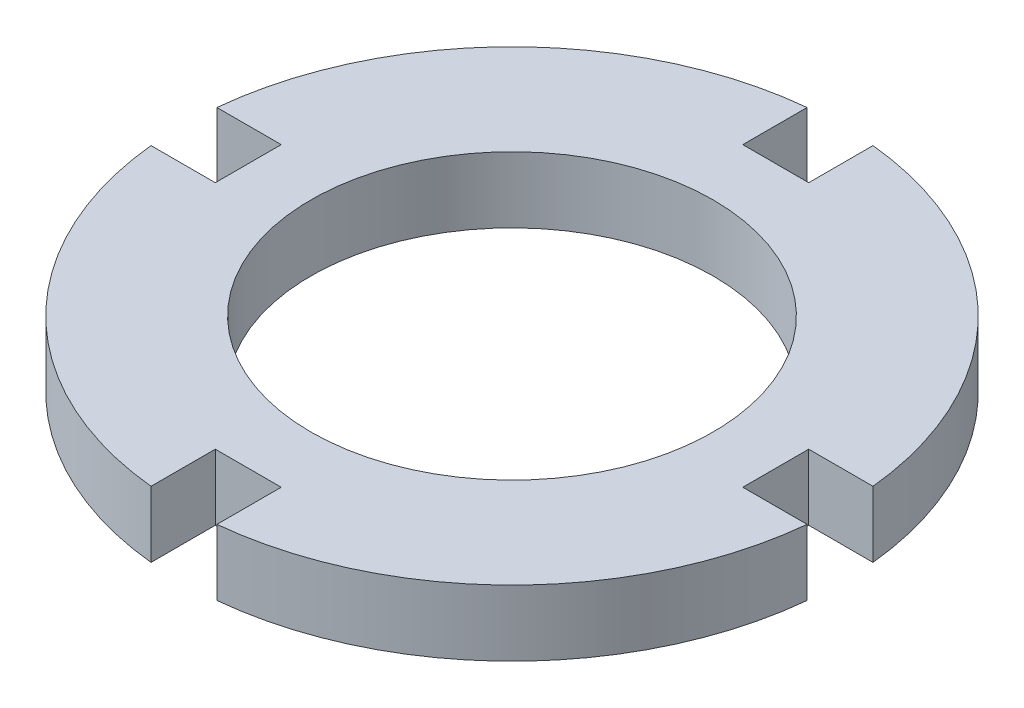
ISO-10303-21;
HEADER;
FILE_DESCRIPTION(('STEP AP214'),'2;1');
FILE_NAME('part.step','',(''),(''),'','','');
FILE_SCHEMA(('AUTOMOTIVE_DESIGN { 1 0 10303 214 1 1 1 1 }'));
ENDSEC;
DATA;
#1=APPLICATION_CONTEXT('core data for automotive mechanical design processes');
#2=APPLICATION_PROTOCOL_DEFINITION('international standard','automotive_design',2000,#1);
#3=PRODUCT_CONTEXT('',#1,'mechanical');
#4=PRODUCT('Part','Part','',(#3));
#5=PRODUCT_RELATED_PRODUCT_CATEGORY('part','',(#4));
#6=PRODUCT_DEFINITION_FORMATION('','',#4);
#7=PRODUCT_DEFINITION_CONTEXT('part definition',#1,'design');
#8=PRODUCT_DEFINITION('design','',#6,#7);
#9=PRODUCT_DEFINITION_SHAPE('','',#8);
#10=(LENGTH_UNIT() NAMED_UNIT(*) SI_UNIT(.MILLI.,.METRE.));
#11=(NAMED_UNIT(*) PLANE_ANGLE_UNIT() SI_UNIT($,.RADIAN.));
#12=(NAMED_UNIT(*) SI_UNIT($,.STERADIAN.) SOLID_ANGLE_UNIT());
#13=UNCERTAINTY_MEASURE_WITH_UNIT(LENGTH_MEASURE(1.E-05),#10,'distance_accuracy_value','');
#14=(GEOMETRIC_REPRESENTATION_CONTEXT(3) GLOBAL_UNCERTAINTY_ASSIGNED_CONTEXT((#13)) GLOBAL_UNIT_ASSIGNED_CONTEXT((#10,
#11,#12)) REPRESENTATION_CONTEXT('',''));
#15=CARTESIAN_POINT('',(0.,0.,0.));
#16=DIRECTION('',(0.,0.,1.));
#17=DIRECTION('',(1.,0.,0.));
#18=AXIS2_PLACEMENT_3D('',#15,#16,#17);
#19=CARTESIAN_POINT('',(0.,5.08,0.));
#20=DIRECTION('',(0.,-1.,0.));
#21=DIRECTION('',(0.,0.,-1.));
#22=AXIS2_PLACEMENT_3D('',#19,#20,#21);
#23=CYLINDRICAL_SURFACE('',#22,25.4);
#24=CARTESIAN_POINT('',(0.,5.08,0.));
#25=DIRECTION('',(0.,1.,0.));
#26=DIRECTION('',(0.,0.,1.));
#27=AXIS2_PLACEMENT_3D('',#24,#25,#26);
#28=CIRCLE('',#27,25.4);
#29=CARTESIAN_POINT('',(-25.2726809025081,5.08,2.54000000000009));
#30=VERTEX_POINT('',#29);
#31=CARTESIAN_POINT('',(-2.54,5.08,25.2726809025081));
#32=VERTEX_POINT('',#31);
#33=EDGE_CURVE('E251',#30,#32,#28,.T.);
#34=ORIENTED_EDGE('',*,*,#33,.F.);
#35=DIRECTION('',(0.,-1.,0.));
#36=VECTOR('',#35,1.);
#37=CARTESIAN_POINT('',(-25.2726809025081,5.08,2.54000000000009));
#38=LINE('',#37,#36);
#39=CARTESIAN_POINT('',(-25.2726809025081,0.,2.54000000000009));
#40=VERTEX_POINT('',#39);
#41=EDGE_CURVE('E218',#30,#40,#38,.T.);
#42=ORIENTED_EDGE('',*,*,#41,.T.);
#43=CARTESIAN_POINT('',(0.,0.,0.));
#44=DIRECTION('',(0.,1.,0.));
#45=DIRECTION('',(0.,0.,1.));
#46=AXIS2_PLACEMENT_3D('',#43,#44,#45);
#47=CIRCLE('',#46,25.4);
#48=CARTESIAN_POINT('',(-2.54,0.,25.2726809025081));
#49=VERTEX_POINT('',#48);
#50=EDGE_CURVE('E255',#40,#49,#47,.T.);
#51=ORIENTED_EDGE('',*,*,#50,.T.);
#52=DIRECTION('',(0.,-1.,0.));
#53=VECTOR('',#52,1.);
#54=CARTESIAN_POINT('',(-2.54,5.08,25.2726809025081));
#55=LINE('',#54,#53);
#56=EDGE_CURVE('E56',#49,#32,#55,.F.);
#57=ORIENTED_EDGE('',*,*,#56,.T.);
#58=EDGE_LOOP('',(#34,#42,#51,#57));
#59=FACE_BOUND('',#58,.T.);
#60=ADVANCED_FACE('F33',(#59),#23,.T.);
#61=CARTESIAN_POINT('',(2.54,5.08,25.2726809025081));
#62=VERTEX_POINT('',#61);
#63=CARTESIAN_POINT('',(25.2726809025082,5.08,2.53999999999974));
#64=VERTEX_POINT('',#63);
#65=EDGE_CURVE('E297',#62,#64,#28,.T.);
#66=ORIENTED_EDGE('',*,*,#65,.F.);
#67=DIRECTION('',(0.,-1.,0.));
#68=VECTOR('',#67,1.);
#69=CARTESIAN_POINT('',(2.54,5.08,25.2726809025081));
#70=LINE('',#69,#68);
#71=CARTESIAN_POINT('',(2.54,0.,25.2726809025081));
#72=VERTEX_POINT('',#71);
#73=EDGE_CURVE('E209',#62,#72,#70,.T.);
#74=ORIENTED_EDGE('',*,*,#73,.T.);
#75=CARTESIAN_POINT('',(25.2726809025082,0.,2.53999999999974));
#76=VERTEX_POINT('',#75);
#77=EDGE_CURVE('E269',#72,#76,#47,.T.);
#78=ORIENTED_EDGE('',*,*,#77,.T.);
#79=DIRECTION('',(0.,-1.,0.));
#80=VECTOR('',#79,1.);
#81=CARTESIAN_POINT('',(25.2726809025082,5.08,2.53999999999974));
#82=LINE('',#81,#80);
#83=EDGE_CURVE('E48',#76,#64,#82,.F.);
#84=ORIENTED_EDGE('',*,*,#83,.T.);
#85=EDGE_LOOP('',(#66,#74,#78,#84));
#86=FACE_BOUND('',#85,.T.);
#87=ADVANCED_FACE('F318',(#86),#23,.T.);
#88=CARTESIAN_POINT('',(25.2726809025081,5.08,-2.54000000000026));
#89=VERTEX_POINT('',#88);
#90=CARTESIAN_POINT('',(2.54,5.08,-25.2726809025081));
#91=VERTEX_POINT('',#90);
#92=EDGE_CURVE('E252',#89,#91,#28,.T.);
#93=ORIENTED_EDGE('',*,*,#92,.F.);
#94=DIRECTION('',(0.,-1.,0.));
#95=VECTOR('',#94,1.);
#96=CARTESIAN_POINT('',(25.2726809025081,5.08,-2.54000000000026));
#97=LINE('',#96,#95);
#98=CARTESIAN_POINT('',(25.2726809025081,0.,-2.54000000000026));
#99=VERTEX_POINT('',#98);
#100=EDGE_CURVE('E199',#89,#99,#97,.T.);
#101=ORIENTED_EDGE('',*,*,#100,.T.);
#102=CARTESIAN_POINT('',(2.54,0.,-25.2726809025081));
#103=VERTEX_POINT('',#102);
#104=EDGE_CURVE('E256',#99,#103,#47,.T.);
#105=ORIENTED_EDGE('',*,*,#104,.T.);
#106=DIRECTION('',(0.,-1.,0.));
#107=VECTOR('',#106,1.);
#108=CARTESIAN_POINT('',(2.54,5.08,-25.2726809025081));
#109=LINE('',#108,#107);
#110=EDGE_CURVE('E233',#103,#91,#109,.F.);
#111=ORIENTED_EDGE('',*,*,#110,.T.);
#112=EDGE_LOOP('',(#93,#101,#105,#111));
#113=FACE_BOUND('',#112,.T.);
#114=ADVANCED_FACE('F277',(#113),#23,.T.);
#115=CARTESIAN_POINT('',(-2.54,0.,-25.2726809025081));
#116=VERTEX_POINT('',#115);
#117=CARTESIAN_POINT('',(-25.2726809025082,0.,-2.53999999999991));
#118=VERTEX_POINT('',#117);
#119=EDGE_CURVE('E253',#116,#118,#47,.T.);
#120=ORIENTED_EDGE('',*,*,#119,.T.);
#121=DIRECTION('',(0.,-1.,0.));
#122=VECTOR('',#121,1.);
#123=CARTESIAN_POINT('',(-25.2726809025082,5.08,-2.53999999999991));
#124=LINE('',#123,#122);
#125=CARTESIAN_POINT('',(-25.2726809025082,5.08,-2.53999999999991));
#126=VERTEX_POINT('',#125);
#127=EDGE_CURVE('E163',#118,#126,#124,.F.);
#128=ORIENTED_EDGE('',*,*,#127,.T.);
#129=CARTESIAN_POINT('',(-2.54,5.08,-25.2726809025081));
#130=VERTEX_POINT('',#129);
#131=EDGE_CURVE('E247',#130,#126,#28,.T.);
#132=ORIENTED_EDGE('',*,*,#131,.F.);
#133=DIRECTION('',(0.,-1.,0.));
#134=VECTOR('',#133,1.);
#135=CARTESIAN_POINT('',(-2.54,5.08,-25.2726809025081));
#136=LINE('',#135,#134);
#137=EDGE_CURVE('E240',#130,#116,#136,.T.);
#138=ORIENTED_EDGE('',*,*,#137,.T.);
#139=EDGE_LOOP('',(#120,#128,#132,#138));
#140=FACE_BOUND('',#139,.T.);
#141=ADVANCED_FACE('F35',(#140),#23,.T.);
#142=CARTESIAN_POINT('',(0.,5.08,0.));
#143=DIRECTION('',(0.,1.,0.));
#144=DIRECTION('',(0.,0.,1.));
#145=AXIS2_PLACEMENT_3D('',#142,#143,#144);
#146=PLANE('',#145);
#147=DIRECTION('',(1.,0.,0.));
#148=VECTOR('',#147,1.);
#149=CARTESIAN_POINT('',(0.,5.08,2.54));
#150=LINE('',#149,#148);
#151=CARTESIAN_POINT('',(-20.32,5.08,2.54000000000007));
#152=VERTEX_POINT('',#151);
#153=EDGE_CURVE('E216',#30,#152,#150,.T.);
#154=ORIENTED_EDGE('',*,*,#153,.F.);
#155=ORIENTED_EDGE('',*,*,#33,.T.);
#156=DIRECTION('',(0.,0.,1.));
#157=VECTOR('',#156,1.);
#158=CARTESIAN_POINT('',(-2.54,5.08,0.));
#159=LINE('',#158,#157);
#160=CARTESIAN_POINT('',(-2.54,5.08,20.32));
#161=VERTEX_POINT('',#160);
#162=EDGE_CURVE('E202',#161,#32,#159,.T.);
#163=ORIENTED_EDGE('',*,*,#162,.F.);
#164=DIRECTION('',(-1.,0.,0.));
#165=VECTOR('',#164,1.);
#166=CARTESIAN_POINT('',(0.,5.08,20.32));
#167=LINE('',#166,#165);
#168=CARTESIAN_POINT('',(2.54,5.08,20.32));
#169=VERTEX_POINT('',#168);
#170=EDGE_CURVE('E205',#169,#161,#167,.T.);
#171=ORIENTED_EDGE('',*,*,#170,.F.);
#172=DIRECTION('',(0.,0.,-1.));
#173=VECTOR('',#172,1.);
#174=CARTESIAN_POINT('',(2.54,5.08,0.));
#175=LINE('',#174,#173);
#176=EDGE_CURVE('E207',#62,#169,#175,.T.);
#177=ORIENTED_EDGE('',*,*,#176,.F.);
#178=ORIENTED_EDGE('',*,*,#65,.T.);
#179=DIRECTION('',(1.,0.,0.));
#180=VECTOR('',#179,1.);
#181=CARTESIAN_POINT('',(0.,5.08,2.54));
#182=LINE('',#181,#180);
#183=CARTESIAN_POINT('',(20.32,5.08,2.53999999999979));
#184=VERTEX_POINT('',#183);
#185=EDGE_CURVE('E174',#184,#64,#182,.T.);
#186=ORIENTED_EDGE('',*,*,#185,.F.);
#187=DIRECTION('',(0.,0.,1.));
#188=VECTOR('',#187,1.);
#189=CARTESIAN_POINT('',(20.32,5.08,-2.12840702415877E-13));
#190=LINE('',#189,#188);
#191=CARTESIAN_POINT('',(20.32,5.08,-2.54000000000021));
#192=VERTEX_POINT('',#191);
#193=EDGE_CURVE('E195',#192,#184,#190,.T.);
#194=ORIENTED_EDGE('',*,*,#193,.F.);
#195=DIRECTION('',(-1.,0.,0.));
#196=VECTOR('',#195,1.);
#197=CARTESIAN_POINT('',(0.,5.08,-2.54));
#198=LINE('',#197,#196);
#199=EDGE_CURVE('E197',#89,#192,#198,.T.);
#200=ORIENTED_EDGE('',*,*,#199,.F.);
#201=ORIENTED_EDGE('',*,*,#92,.T.);
#202=DIRECTION('',(0.,0.,-1.));
#203=VECTOR('',#202,1.);
#204=CARTESIAN_POINT('',(2.54,5.08,0.));
#205=LINE('',#204,#203);
#206=CARTESIAN_POINT('',(2.54,5.08,-20.32));
#207=VERTEX_POINT('',#206);
#208=EDGE_CURVE('E229',#207,#91,#205,.T.);
#209=ORIENTED_EDGE('',*,*,#208,.F.);
#210=DIRECTION('',(1.,0.,0.));
#211=VECTOR('',#210,1.);
#212=CARTESIAN_POINT('',(0.,5.08,-20.32));
#213=LINE('',#212,#211);
#214=CARTESIAN_POINT('',(-2.54,5.08,-20.32));
#215=VERTEX_POINT('',#214);
#216=EDGE_CURVE('E236',#215,#207,#213,.T.);
#217=ORIENTED_EDGE('',*,*,#216,.F.);
#218=DIRECTION('',(0.,0.,1.));
#219=VECTOR('',#218,1.);
#220=CARTESIAN_POINT('',(-2.54,5.08,0.));
#221=LINE('',#220,#219);
#222=EDGE_CURVE('E238',#130,#215,#221,.T.);
#223=ORIENTED_EDGE('',*,*,#222,.F.);
#224=ORIENTED_EDGE('',*,*,#131,.T.);
#225=DIRECTION('',(-1.,0.,0.));
#226=VECTOR('',#225,1.);
#227=CARTESIAN_POINT('',(0.,5.08,-2.54));
#228=LINE('',#227,#226);
#229=CARTESIAN_POINT('',(-20.32,5.08,-2.53999999999993));
#230=VERTEX_POINT('',#229);
#231=EDGE_CURVE('E212',#230,#126,#228,.T.);
#232=ORIENTED_EDGE('',*,*,#231,.F.);
#233=DIRECTION('',(0.,0.,-1.));
#234=VECTOR('',#233,1.);
#235=CARTESIAN_POINT('',(-20.32,5.08,0.));
#236=LINE('',#235,#234);
#237=EDGE_CURVE('E156',#152,#230,#236,.T.);
#238=ORIENTED_EDGE('',*,*,#237,.F.);
#239=EDGE_LOOP('',(#154,#155,#163,#171,#177,#178,#186,#194,#200,#201,#209,#217,#223,#224,#232,#238));
#240=FACE_BOUND('',#239,.T.);
#241=CARTESIAN_POINT('',(0.,5.08,0.));
#242=DIRECTION('',(0.,1.,0.));
#243=DIRECTION('',(0.,0.,1.));
#244=AXIS2_PLACEMENT_3D('',#241,#242,#243);
#245=CIRCLE('',#244,15.494);
#246=CARTESIAN_POINT('',(0.,5.08,15.494));
#247=VERTEX_POINT('',#246);
#248=EDGE_CURVE('E243',#247,#247,#245,.T.);
#249=ORIENTED_EDGE('',*,*,#248,.F.);
#250=EDGE_LOOP('',(#249));
#251=FACE_BOUND('',#250,.T.);
#252=ADVANCED_FACE('F292',(#240,#251),#146,.T.);
#253=CARTESIAN_POINT('',(0.,0.,0.));
#254=DIRECTION('',(0.,1.,0.));
#255=DIRECTION('',(0.,0.,1.));
#256=AXIS2_PLACEMENT_3D('',#253,#254,#255);
#257=PLANE('',#256);
#258=CARTESIAN_POINT('',(0.,0.,0.));
#259=DIRECTION('',(0.,1.,0.));
#260=DIRECTION('',(0.,0.,1.));
#261=AXIS2_PLACEMENT_3D('',#258,#259,#260);
#262=CIRCLE('',#261,15.494);
#263=CARTESIAN_POINT('',(0.,0.,15.494));
#264=VERTEX_POINT('',#263);
#265=EDGE_CURVE('E246',#264,#264,#262,.T.);
#266=ORIENTED_EDGE('',*,*,#265,.T.);
#267=EDGE_LOOP('',(#266));
#268=FACE_BOUND('',#267,.T.);
#269=ORIENTED_EDGE('',*,*,#50,.F.);
#270=DIRECTION('',(-1.,0.,0.));
#271=VECTOR('',#270,1.);
#272=CARTESIAN_POINT('',(-30.48,0.,2.54000000000011));
#273=LINE('',#272,#271);
#274=CARTESIAN_POINT('',(-20.32,0.,2.54000000000007));
#275=VERTEX_POINT('',#274);
#276=EDGE_CURVE('E169',#275,#40,#273,.T.);
#277=ORIENTED_EDGE('',*,*,#276,.F.);
#278=DIRECTION('',(0.,0.,1.));
#279=VECTOR('',#278,1.);
#280=CARTESIAN_POINT('',(-20.32,0.,-2.53999999999993));
#281=LINE('',#280,#279);
#282=CARTESIAN_POINT('',(-20.32,0.,-2.53999999999993));
#283=VERTEX_POINT('',#282);
#284=EDGE_CURVE('E153',#283,#275,#281,.T.);
#285=ORIENTED_EDGE('',*,*,#284,.F.);
#286=DIRECTION('',(-1.,0.,0.));
#287=VECTOR('',#286,1.);
#288=CARTESIAN_POINT('',(0.,0.,-2.54));
#289=LINE('',#288,#287);
#290=EDGE_CURVE('E11',#283,#118,#289,.T.);
#291=ORIENTED_EDGE('',*,*,#290,.T.);
#292=ORIENTED_EDGE('',*,*,#119,.F.);
#293=DIRECTION('',(0.,0.,-1.));
#294=VECTOR('',#293,1.);
#295=CARTESIAN_POINT('',(-2.54,0.,-30.48));
#296=LINE('',#295,#294);
#297=CARTESIAN_POINT('',(-2.54,0.,-20.32));
#298=VERTEX_POINT('',#297);
#299=EDGE_CURVE('E221',#298,#116,#296,.T.);
#300=ORIENTED_EDGE('',*,*,#299,.F.);
#301=DIRECTION('',(-1.,0.,0.));
#302=VECTOR('',#301,1.);
#303=CARTESIAN_POINT('',(2.54,0.,-20.32));
#304=LINE('',#303,#302);
#305=CARTESIAN_POINT('',(2.54,0.,-20.32));
#306=VERTEX_POINT('',#305);
#307=EDGE_CURVE('E223',#306,#298,#304,.T.);
#308=ORIENTED_EDGE('',*,*,#307,.F.);
#309=DIRECTION('',(0.,0.,-1.));
#310=VECTOR('',#309,1.);
#311=CARTESIAN_POINT('',(2.54,0.,0.));
#312=LINE('',#311,#310);
#313=EDGE_CURVE('E250',#306,#103,#312,.T.);
#314=ORIENTED_EDGE('',*,*,#313,.T.);
#315=ORIENTED_EDGE('',*,*,#104,.F.);
#316=DIRECTION('',(1.,0.,0.));
#317=VECTOR('',#316,1.);
#318=CARTESIAN_POINT('',(30.48,0.,-2.54000000000032));
#319=LINE('',#318,#317);
#320=CARTESIAN_POINT('',(20.32,0.,-2.54000000000021));
#321=VERTEX_POINT('',#320);
#322=EDGE_CURVE('E185',#321,#99,#319,.T.);
#323=ORIENTED_EDGE('',*,*,#322,.F.);
#324=DIRECTION('',(0.,0.,-1.));
#325=VECTOR('',#324,1.);
#326=CARTESIAN_POINT('',(20.32,0.,2.53999999999979));
#327=LINE('',#326,#325);
#328=CARTESIAN_POINT('',(20.32,0.,2.53999999999979));
#329=VERTEX_POINT('',#328);
#330=EDGE_CURVE('E187',#329,#321,#327,.T.);
#331=ORIENTED_EDGE('',*,*,#330,.F.);
#332=DIRECTION('',(1.,0.,0.));
#333=VECTOR('',#332,1.);
#334=CARTESIAN_POINT('',(0.,0.,2.54));
#335=LINE('',#334,#333);
#336=EDGE_CURVE('E261',#329,#76,#335,.T.);
#337=ORIENTED_EDGE('',*,*,#336,.T.);
#338=ORIENTED_EDGE('',*,*,#77,.F.);
#339=DIRECTION('',(0.,0.,1.));
#340=VECTOR('',#339,1.);
#341=CARTESIAN_POINT('',(2.54,0.,30.48));
#342=LINE('',#341,#340);
#343=CARTESIAN_POINT('',(2.54,0.,20.32));
#344=VERTEX_POINT('',#343);
#345=EDGE_CURVE('E176',#344,#72,#342,.T.);
#346=ORIENTED_EDGE('',*,*,#345,.F.);
#347=DIRECTION('',(1.,0.,0.));
#348=VECTOR('',#347,1.);
#349=CARTESIAN_POINT('',(-2.54,0.,20.32));
#350=LINE('',#349,#348);
#351=CARTESIAN_POINT('',(-2.54,0.,20.32));
#352=VERTEX_POINT('',#351);
#353=EDGE_CURVE('E178',#352,#344,#350,.T.);
#354=ORIENTED_EDGE('',*,*,#353,.F.);
#355=DIRECTION('',(0.,0.,1.));
#356=VECTOR('',#355,1.);
#357=CARTESIAN_POINT('',(-2.54,0.,0.));
#358=LINE('',#357,#356);
#359=EDGE_CURVE('E41',#352,#49,#358,.T.);
#360=ORIENTED_EDGE('',*,*,#359,.T.);
#361=EDGE_LOOP('',(#269,#277,#285,#291,#292,#300,#308,#314,#315,#323,#331,#337,#338,#346,#354,#360));
#362=FACE_BOUND('',#361,.T.);
#363=ADVANCED_FACE('F168',(#268,#362),#257,.F.);
#364=CARTESIAN_POINT('',(0.,-45.72,0.));
#365=DIRECTION('',(0.,1.,0.));
#366=DIRECTION('',(0.,0.,1.));
#367=AXIS2_PLACEMENT_3D('',#364,#365,#366);
#368=CYLINDRICAL_SURFACE('',#367,15.494);
#369=ORIENTED_EDGE('',*,*,#248,.T.);
#370=EDGE_LOOP('',(#369));
#371=FACE_BOUND('',#370,.T.);
#372=ORIENTED_EDGE('',*,*,#265,.F.);
#373=EDGE_LOOP('',(#372));
#374=FACE_BOUND('',#373,.T.);
#375=ADVANCED_FACE('F333',(#371,#374),#368,.F.);
#376=CARTESIAN_POINT('',(-2.54,50.8,-30.48));
#377=DIRECTION('',(-1.,0.,0.));
#378=DIRECTION('',(0.,0.,1.));
#379=AXIS2_PLACEMENT_3D('',#376,#377,#378);
#380=PLANE('',#379);
#381=ORIENTED_EDGE('',*,*,#222,.T.);
#382=DIRECTION('',(0.,-1.,0.));
#383=VECTOR('',#382,1.);
#384=CARTESIAN_POINT('',(-2.54,50.8,-20.32));
#385=LINE('',#384,#383);
#386=EDGE_CURVE('E227',#215,#298,#385,.T.);
#387=ORIENTED_EDGE('',*,*,#386,.T.);
#388=ORIENTED_EDGE('',*,*,#299,.T.);
#389=ORIENTED_EDGE('',*,*,#137,.F.);
#390=EDGE_LOOP('',(#381,#387,#388,#389));
#391=FACE_BOUND('',#390,.T.);
#392=ADVANCED_FACE('F331',(#391),#380,.F.);
#393=CARTESIAN_POINT('',(2.54,50.8,-30.48));
#394=DIRECTION('',(1.,0.,0.));
#395=DIRECTION('',(0.,0.,-1.));
#396=AXIS2_PLACEMENT_3D('',#393,#394,#395);
#397=PLANE('',#396);
#398=ORIENTED_EDGE('',*,*,#313,.F.);
#399=DIRECTION('',(0.,-1.,0.));
#400=VECTOR('',#399,1.);
#401=CARTESIAN_POINT('',(2.54,50.8,-20.32));
#402=LINE('',#401,#400);
#403=EDGE_CURVE('E226',#207,#306,#402,.T.);
#404=ORIENTED_EDGE('',*,*,#403,.F.);
#405=ORIENTED_EDGE('',*,*,#208,.T.);
#406=ORIENTED_EDGE('',*,*,#110,.F.);
#407=EDGE_LOOP('',(#398,#404,#405,#406));
#408=FACE_BOUND('',#407,.T.);
#409=ADVANCED_FACE('F281',(#408),#397,.F.);
#410=CARTESIAN_POINT('',(2.54,50.8,-20.32));
#411=DIRECTION('',(0.,0.,1.));
#412=DIRECTION('',(1.,0.,0.));
#413=AXIS2_PLACEMENT_3D('',#410,#411,#412);
#414=PLANE('',#413);
#415=ORIENTED_EDGE('',*,*,#216,.T.);
#416=ORIENTED_EDGE('',*,*,#403,.T.);
#417=ORIENTED_EDGE('',*,*,#307,.T.);
#418=ORIENTED_EDGE('',*,*,#386,.F.);
#419=EDGE_LOOP('',(#415,#416,#417,#418));
#420=FACE_BOUND('',#419,.T.);
#421=ADVANCED_FACE('F288',(#420),#414,.F.);
#422=CARTESIAN_POINT('',(30.48,50.8,-2.54000000000032));
#423=DIRECTION('',(0.,0.,-1.));
#424=DIRECTION('',(-1.,0.,0.));
#425=AXIS2_PLACEMENT_3D('',#422,#423,#424);
#426=PLANE('',#425);
#427=ORIENTED_EDGE('',*,*,#199,.T.);
#428=DIRECTION('',(0.,-1.,0.));
#429=VECTOR('',#428,1.);
#430=CARTESIAN_POINT('',(20.32,50.8,-2.54000000000021));
#431=LINE('',#430,#429);
#432=EDGE_CURVE('E179',#192,#321,#431,.T.);
#433=ORIENTED_EDGE('',*,*,#432,.T.);
#434=ORIENTED_EDGE('',*,*,#322,.T.);
#435=ORIENTED_EDGE('',*,*,#100,.F.);
#436=EDGE_LOOP('',(#427,#433,#434,#435));
#437=FACE_BOUND('',#436,.T.);
#438=ADVANCED_FACE('F374',(#437),#426,.F.);
#439=CARTESIAN_POINT('',(30.48,50.8,2.53999999999968));
#440=DIRECTION('',(0.,0.,1.));
#441=DIRECTION('',(1.,0.,0.));
#442=AXIS2_PLACEMENT_3D('',#439,#440,#441);
#443=PLANE('',#442);
#444=ORIENTED_EDGE('',*,*,#336,.F.);
#445=DIRECTION('',(0.,-1.,0.));
#446=VECTOR('',#445,1.);
#447=CARTESIAN_POINT('',(20.32,50.8,2.53999999999979));
#448=LINE('',#447,#446);
#449=EDGE_CURVE('E190',#184,#329,#448,.T.);
#450=ORIENTED_EDGE('',*,*,#449,.F.);
#451=ORIENTED_EDGE('',*,*,#185,.T.);
#452=ORIENTED_EDGE('',*,*,#83,.F.);
#453=EDGE_LOOP('',(#444,#450,#451,#452));
#454=FACE_BOUND('',#453,.T.);
#455=ADVANCED_FACE('F409',(#454),#443,.F.);
#456=CARTESIAN_POINT('',(20.32,50.8,2.53999999999979));
#457=DIRECTION('',(-1.,0.,0.));
#458=DIRECTION('',(0.,0.,1.));
#459=AXIS2_PLACEMENT_3D('',#456,#457,#458);
#460=PLANE('',#459);
#461=ORIENTED_EDGE('',*,*,#193,.T.);
#462=ORIENTED_EDGE('',*,*,#449,.T.);
#463=ORIENTED_EDGE('',*,*,#330,.T.);
#464=ORIENTED_EDGE('',*,*,#432,.F.);
#465=EDGE_LOOP('',(#461,#462,#463,#464));
#466=FACE_BOUND('',#465,.T.);
#467=ADVANCED_FACE('F418',(#466),#460,.F.);
#468=CARTESIAN_POINT('',(2.54,50.8,30.48));
#469=DIRECTION('',(1.,0.,0.));
#470=DIRECTION('',(0.,0.,-1.));
#471=AXIS2_PLACEMENT_3D('',#468,#469,#470);
#472=PLANE('',#471);
#473=ORIENTED_EDGE('',*,*,#176,.T.);
#474=DIRECTION('',(0.,-1.,0.));
#475=VECTOR('',#474,1.);
#476=CARTESIAN_POINT('',(2.54,50.8,20.32));
#477=LINE('',#476,#475);
#478=EDGE_CURVE('E171',#169,#344,#477,.T.);
#479=ORIENTED_EDGE('',*,*,#478,.T.);
#480=ORIENTED_EDGE('',*,*,#345,.T.);
#481=ORIENTED_EDGE('',*,*,#73,.F.);
#482=EDGE_LOOP('',(#473,#479,#480,#481));
#483=FACE_BOUND('',#482,.T.);
#484=ADVANCED_FACE('F426',(#483),#472,.F.);
#485=CARTESIAN_POINT('',(-2.54,50.8,30.48));
#486=DIRECTION('',(-1.,0.,0.));
#487=DIRECTION('',(0.,0.,1.));
#488=AXIS2_PLACEMENT_3D('',#485,#486,#487);
#489=PLANE('',#488);
#490=ORIENTED_EDGE('',*,*,#359,.F.);
#491=DIRECTION('',(0.,-1.,0.));
#492=VECTOR('',#491,1.);
#493=CARTESIAN_POINT('',(-2.54,50.8,20.32));
#494=LINE('',#493,#492);
#495=EDGE_CURVE('E182',#161,#352,#494,.T.);
#496=ORIENTED_EDGE('',*,*,#495,.F.);
#497=ORIENTED_EDGE('',*,*,#162,.T.);
#498=ORIENTED_EDGE('',*,*,#56,.F.);
#499=EDGE_LOOP('',(#490,#496,#497,#498));
#500=FACE_BOUND('',#499,.T.);
#501=ADVANCED_FACE('F314',(#500),#489,.F.);
#502=CARTESIAN_POINT('',(-2.54,50.8,20.32));
#503=DIRECTION('',(0.,0.,-1.));
#504=DIRECTION('',(-1.,0.,0.));
#505=AXIS2_PLACEMENT_3D('',#502,#503,#504);
#506=PLANE('',#505);
#507=ORIENTED_EDGE('',*,*,#170,.T.);
#508=ORIENTED_EDGE('',*,*,#495,.T.);
#509=ORIENTED_EDGE('',*,*,#353,.T.);
#510=ORIENTED_EDGE('',*,*,#478,.F.);
#511=EDGE_LOOP('',(#507,#508,#509,#510));
#512=FACE_BOUND('',#511,.T.);
#513=ADVANCED_FACE('F307',(#512),#506,.F.);
#514=CARTESIAN_POINT('',(-30.48,50.8,2.54000000000011));
#515=DIRECTION('',(0.,0.,1.));
#516=DIRECTION('',(1.,0.,0.));
#517=AXIS2_PLACEMENT_3D('',#514,#515,#516);
#518=PLANE('',#517);
#519=ORIENTED_EDGE('',*,*,#153,.T.);
#520=DIRECTION('',(0.,-1.,0.));
#521=VECTOR('',#520,1.);
#522=CARTESIAN_POINT('',(-20.32,50.8,2.54000000000007));
#523=LINE('',#522,#521);
#524=EDGE_CURVE('E159',#152,#275,#523,.T.);
#525=ORIENTED_EDGE('',*,*,#524,.T.);
#526=ORIENTED_EDGE('',*,*,#276,.T.);
#527=ORIENTED_EDGE('',*,*,#41,.F.);
#528=EDGE_LOOP('',(#519,#525,#526,#527));
#529=FACE_BOUND('',#528,.T.);
#530=ADVANCED_FACE('F305',(#529),#518,.F.);
#531=CARTESIAN_POINT('',(-30.48,50.8,-2.53999999999989));
#532=DIRECTION('',(0.,0.,-1.));
#533=DIRECTION('',(-1.,0.,0.));
#534=AXIS2_PLACEMENT_3D('',#531,#532,#533);
#535=PLANE('',#534);
#536=ORIENTED_EDGE('',*,*,#290,.F.);
#537=DIRECTION('',(0.,-1.,0.));
#538=VECTOR('',#537,1.);
#539=CARTESIAN_POINT('',(-20.32,50.8,-2.53999999999993));
#540=LINE('',#539,#538);
#541=EDGE_CURVE('E148',#230,#283,#540,.T.);
#542=ORIENTED_EDGE('',*,*,#541,.F.);
#543=ORIENTED_EDGE('',*,*,#231,.T.);
#544=ORIENTED_EDGE('',*,*,#127,.F.);
#545=EDGE_LOOP('',(#536,#542,#543,#544));
#546=FACE_BOUND('',#545,.T.);
#547=ADVANCED_FACE('F161',(#546),#535,.F.);
#548=CARTESIAN_POINT('',(-20.32,50.8,-2.53999999999993));
#549=DIRECTION('',(1.,0.,0.));
#550=DIRECTION('',(0.,0.,-1.));
#551=AXIS2_PLACEMENT_3D('',#548,#549,#550);
#552=PLANE('',#551);
#553=ORIENTED_EDGE('',*,*,#237,.T.);
#554=ORIENTED_EDGE('',*,*,#541,.T.);
#555=ORIENTED_EDGE('',*,*,#284,.T.);
#556=ORIENTED_EDGE('',*,*,#524,.F.);
#557=EDGE_LOOP('',(#553,#554,#555,#556));
#558=FACE_BOUND('',#557,.T.);
#559=ADVANCED_FACE('F150',(#558),#552,.F.);
#560=CLOSED_SHELL('',(#60,#87,#114,#141,#252,#363,#375,#392,#409,#421,#438,#455,#467,#484,#501,
#513,#530,#547,#559));
#561=MANIFOLD_SOLID_BREP('B2',#560);
#562=ADVANCED_BREP_SHAPE_REPRESENTATION('',(#18,#561),#14);
#563=SHAPE_DEFINITION_REPRESENTATION(#9,#562);
ENDSEC;
END-ISO-10303-21;
